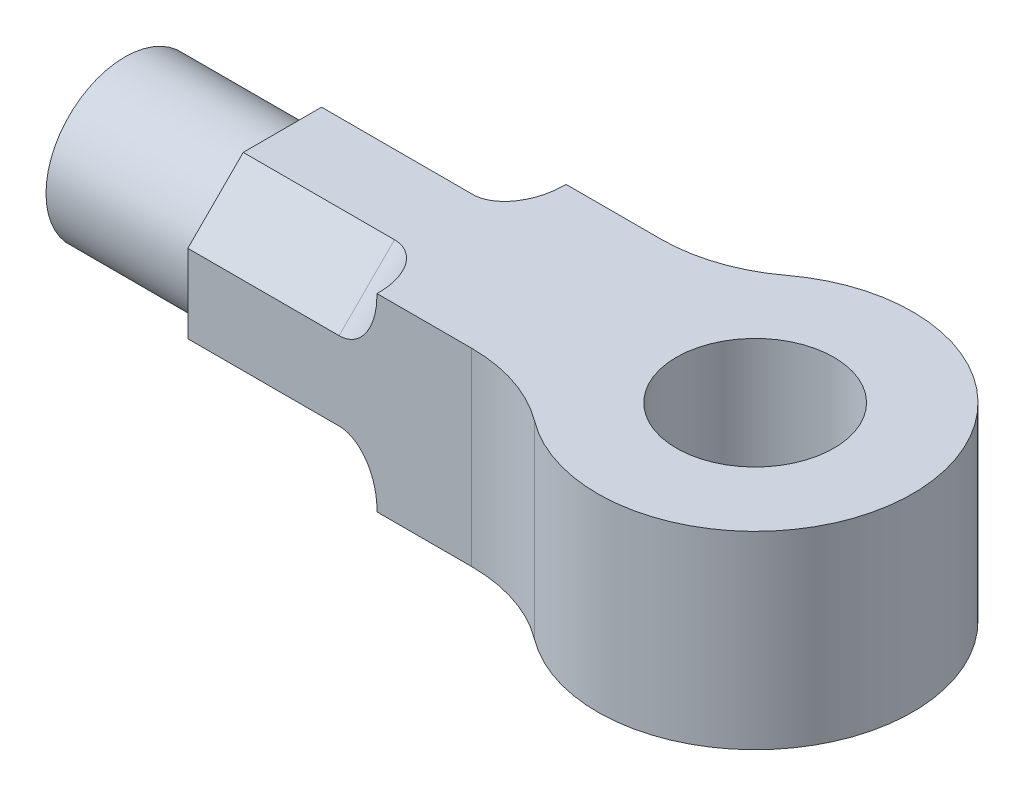
ISO-10303-21;
HEADER;
FILE_DESCRIPTION(('STEP AP214'),'2;1');
FILE_NAME('part.step','',(''),(''),'','','');
FILE_SCHEMA(('AUTOMOTIVE_DESIGN { 1 0 10303 214 1 1 1 1 }'));
ENDSEC;
DATA;
#1=APPLICATION_CONTEXT('core data for automotive mechanical design processes');
#2=APPLICATION_PROTOCOL_DEFINITION('international standard','automotive_design',2000,#1);
#3=PRODUCT_CONTEXT('',#1,'mechanical');
#4=PRODUCT('Part','Part','',(#3));
#5=PRODUCT_RELATED_PRODUCT_CATEGORY('part','',(#4));
#6=PRODUCT_DEFINITION_FORMATION('','',#4);
#7=PRODUCT_DEFINITION_CONTEXT('part definition',#1,'design');
#8=PRODUCT_DEFINITION('design','',#6,#7);
#9=PRODUCT_DEFINITION_SHAPE('','',#8);
#10=(LENGTH_UNIT() NAMED_UNIT(*) SI_UNIT(.MILLI.,.METRE.));
#11=(NAMED_UNIT(*) PLANE_ANGLE_UNIT() SI_UNIT($,.RADIAN.));
#12=(NAMED_UNIT(*) SI_UNIT($,.STERADIAN.) SOLID_ANGLE_UNIT());
#13=UNCERTAINTY_MEASURE_WITH_UNIT(LENGTH_MEASURE(1.E-05),#10,'distance_accuracy_value','');
#14=(GEOMETRIC_REPRESENTATION_CONTEXT(3) GLOBAL_UNCERTAINTY_ASSIGNED_CONTEXT((#13)) GLOBAL_UNIT_ASSIGNED_CONTEXT((#10,
#11,#12)) REPRESENTATION_CONTEXT('',''));
#15=CARTESIAN_POINT('',(0.,0.,0.));
#16=DIRECTION('',(0.,0.,1.));
#17=DIRECTION('',(1.,0.,0.));
#18=AXIS2_PLACEMENT_3D('',#15,#16,#17);
#19=CARTESIAN_POINT('',(0.,60.,60.));
#20=DIRECTION('',(0.,-1.,0.));
#21=DIRECTION('',(1.,0.,0.));
#22=AXIS2_PLACEMENT_3D('',#19,#20,#21);
#23=PLANE('',#22);
#24=CARTESIAN_POINT('',(-50.,60.,30.));
#25=DIRECTION('',(0.,1.,0.));
#26=DIRECTION('',(-1.,0.,0.));
#27=AXIS2_PLACEMENT_3D('',#24,#25,#26);
#28=CIRCLE('',#27,25.);
#29=CARTESIAN_POINT('',(-75.,60.,30.));
#30=VERTEX_POINT('',#29);
#31=EDGE_CURVE('E293',#30,#30,#28,.T.);
#32=ORIENTED_EDGE('',*,*,#31,.F.);
#33=EDGE_LOOP('',(#32));
#34=FACE_BOUND('',#33,.T.);
#35=DIRECTION('',(0.,0.,-1.));
#36=VECTOR('',#35,1.);
#37=CARTESIAN_POINT('',(-140.,60.,0.));
#38=LINE('',#37,#36);
#39=CARTESIAN_POINT('',(-140.,60.,0.603030380330022));
#40=VERTEX_POINT('',#39);
#41=CARTESIAN_POINT('',(-140.,60.,0.));
#42=VERTEX_POINT('',#41);
#43=EDGE_CURVE('E192',#40,#42,#38,.T.);
#44=ORIENTED_EDGE('',*,*,#43,.F.);
#45=CARTESIAN_POINT('',(-152.,60.,0.603030380330022));
#46=DIRECTION('',(0.,-1.,0.));
#47=DIRECTION('',(0.,0.,1.));
#48=AXIS2_PLACEMENT_3D('',#45,#46,#47);
#49=ELLIPSE('',#48,16.9705627484771,12.);
#50=CARTESIAN_POINT('',(-152.,60.,17.5735931288072));
#51=VERTEX_POINT('',#50);
#52=EDGE_CURVE('E178',#40,#51,#49,.T.);
#53=ORIENTED_EDGE('',*,*,#52,.T.);
#54=DIRECTION('',(-1.,0.,0.));
#55=VECTOR('',#54,1.);
#56=CARTESIAN_POINT('',(-140.,60.,17.5735931288072));
#57=LINE('',#56,#55);
#58=CARTESIAN_POINT('',(-200.,60.,17.5735931288072));
#59=VERTEX_POINT('',#58);
#60=EDGE_CURVE('E171',#51,#59,#57,.T.);
#61=ORIENTED_EDGE('',*,*,#60,.T.);
#62=DIRECTION('',(0.,0.,-1.));
#63=VECTOR('',#62,1.);
#64=CARTESIAN_POINT('',(-200.,60.,60.));
#65=LINE('',#64,#63);
#66=CARTESIAN_POINT('',(-200.,60.,42.4264068711929));
#67=VERTEX_POINT('',#66);
#68=EDGE_CURVE('E176',#67,#59,#65,.T.);
#69=ORIENTED_EDGE('',*,*,#68,.F.);
#70=DIRECTION('',(-1.,0.,0.));
#71=VECTOR('',#70,1.);
#72=CARTESIAN_POINT('',(-140.,60.,42.4264068711929));
#73=LINE('',#72,#71);
#74=CARTESIAN_POINT('',(-152.,60.,42.4264068711929));
#75=VERTEX_POINT('',#74);
#76=EDGE_CURVE('E301',#75,#67,#73,.T.);
#77=ORIENTED_EDGE('',*,*,#76,.F.);
#78=CARTESIAN_POINT('',(-152.,60.,59.39696961967));
#79=DIRECTION('',(0.,-1.,0.));
#80=DIRECTION('',(0.,0.,1.));
#81=AXIS2_PLACEMENT_3D('',#78,#79,#80);
#82=ELLIPSE('',#81,16.9705627484771,12.);
#83=CARTESIAN_POINT('',(-140.,60.,59.39696961967));
#84=VERTEX_POINT('',#83);
#85=EDGE_CURVE('E240',#75,#84,#82,.T.);
#86=ORIENTED_EDGE('',*,*,#85,.T.);
#87=DIRECTION('',(0.,0.,-1.));
#88=VECTOR('',#87,1.);
#89=CARTESIAN_POINT('',(-140.,60.,0.));
#90=LINE('',#89,#88);
#91=CARTESIAN_POINT('',(-140.,60.,60.));
#92=VERTEX_POINT('',#91);
#93=EDGE_CURVE('E304',#92,#84,#90,.T.);
#94=ORIENTED_EDGE('',*,*,#93,.F.);
#95=DIRECTION('',(-1.,0.,0.));
#96=VECTOR('',#95,1.);
#97=CARTESIAN_POINT('',(0.,60.,60.));
#98=LINE('',#97,#96);
#99=CARTESIAN_POINT('',(-110.,60.,60.));
#100=VERTEX_POINT('',#99);
#101=EDGE_CURVE('E261',#100,#92,#98,.T.);
#102=ORIENTED_EDGE('',*,*,#101,.F.);
#103=CARTESIAN_POINT('',(-110.,60.,110.));
#104=DIRECTION('',(0.,-1.,0.));
#105=DIRECTION('',(1.,0.,0.));
#106=AXIS2_PLACEMENT_3D('',#103,#104,#105);
#107=CIRCLE('',#106,50.);
#108=CARTESIAN_POINT('',(-80.,60.,70.));
#109=VERTEX_POINT('',#108);
#110=EDGE_CURVE('E54',#100,#109,#107,.T.);
#111=ORIENTED_EDGE('',*,*,#110,.T.);
#112=CARTESIAN_POINT('',(-50.,60.,30.));
#113=DIRECTION('',(0.,1.,0.));
#114=DIRECTION('',(-1.,0.,0.));
#115=AXIS2_PLACEMENT_3D('',#112,#113,#114);
#116=CIRCLE('',#115,50.);
#117=CARTESIAN_POINT('',(-80.,60.,-10.));
#118=VERTEX_POINT('',#117);
#119=EDGE_CURVE('E259',#109,#118,#116,.T.);
#120=ORIENTED_EDGE('',*,*,#119,.T.);
#121=CARTESIAN_POINT('',(-110.,60.,-50.));
#122=DIRECTION('',(0.,-1.,0.));
#123=DIRECTION('',(1.,0.,0.));
#124=AXIS2_PLACEMENT_3D('',#121,#122,#123);
#125=CIRCLE('',#124,50.);
#126=CARTESIAN_POINT('',(-110.,60.,0.));
#127=VERTEX_POINT('',#126);
#128=EDGE_CURVE('E253',#118,#127,#125,.T.);
#129=ORIENTED_EDGE('',*,*,#128,.T.);
#130=DIRECTION('',(-1.,0.,0.));
#131=VECTOR('',#130,1.);
#132=CARTESIAN_POINT('',(0.,60.,0.));
#133=LINE('',#132,#131);
#134=EDGE_CURVE('E283',#127,#42,#133,.T.);
#135=ORIENTED_EDGE('',*,*,#134,.T.);
#136=EDGE_LOOP('',(#44,#53,#61,#69,#77,#86,#94,#102,#111,#120,#129,#135));
#137=FACE_BOUND('',#136,.T.);
#138=ADVANCED_FACE('F46',(#34,#137),#23,.F.);
#139=CARTESIAN_POINT('',(0.,0.,60.));
#140=DIRECTION('',(0.,0.,-1.));
#141=DIRECTION('',(-1.,0.,0.));
#142=AXIS2_PLACEMENT_3D('',#139,#140,#141);
#143=PLANE('',#142);
#144=DIRECTION('',(1.,0.,0.));
#145=VECTOR('',#144,1.);
#146=CARTESIAN_POINT('',(0.,0.,60.));
#147=LINE('',#146,#145);
#148=CARTESIAN_POINT('',(-140.,0.,60.));
#149=VERTEX_POINT('',#148);
#150=CARTESIAN_POINT('',(-110.,0.,60.));
#151=VERTEX_POINT('',#150);
#152=EDGE_CURVE('E207',#149,#151,#147,.T.);
#153=ORIENTED_EDGE('',*,*,#152,.T.);
#154=DIRECTION('',(0.,1.,0.));
#155=VECTOR('',#154,1.);
#156=CARTESIAN_POINT('',(-110.,0.,60.));
#157=LINE('',#156,#155);
#158=EDGE_CURVE('E251',#151,#100,#157,.T.);
#159=ORIENTED_EDGE('',*,*,#158,.T.);
#160=ORIENTED_EDGE('',*,*,#101,.T.);
#161=DIRECTION('',(0.,1.,0.));
#162=VECTOR('',#161,1.);
#163=CARTESIAN_POINT('',(-140.,0.,60.));
#164=LINE('',#163,#162);
#165=CARTESIAN_POINT('',(-140.,59.39696961967,60.));
#166=VERTEX_POINT('',#165);
#167=EDGE_CURVE('E307',#166,#92,#164,.T.);
#168=ORIENTED_EDGE('',*,*,#167,.F.);
#169=CARTESIAN_POINT('',(-152.,59.39696961967,60.));
#170=DIRECTION('',(0.,0.,-1.));
#171=DIRECTION('',(0.,-1.,0.));
#172=AXIS2_PLACEMENT_3D('',#169,#170,#171);
#173=ELLIPSE('',#172,16.9705627484771,12.);
#174=CARTESIAN_POINT('',(-152.,42.4264068711928,60.));
#175=VERTEX_POINT('',#174);
#176=EDGE_CURVE('E242',#166,#175,#173,.T.);
#177=ORIENTED_EDGE('',*,*,#176,.T.);
#178=DIRECTION('',(-1.,0.,0.));
#179=VECTOR('',#178,1.);
#180=CARTESIAN_POINT('',(-140.,42.4264068711928,60.));
#181=LINE('',#180,#179);
#182=CARTESIAN_POINT('',(-200.,42.4264068711928,60.));
#183=VERTEX_POINT('',#182);
#184=EDGE_CURVE('E302',#175,#183,#181,.T.);
#185=ORIENTED_EDGE('',*,*,#184,.T.);
#186=DIRECTION('',(0.,-1.,0.));
#187=VECTOR('',#186,1.);
#188=CARTESIAN_POINT('',(-200.,60.,60.));
#189=LINE('',#188,#187);
#190=CARTESIAN_POINT('',(-200.,17.5735931288072,60.));
#191=VERTEX_POINT('',#190);
#192=EDGE_CURVE('E277',#183,#191,#189,.T.);
#193=ORIENTED_EDGE('',*,*,#192,.T.);
#194=DIRECTION('',(-1.,0.,0.));
#195=VECTOR('',#194,1.);
#196=CARTESIAN_POINT('',(-140.,17.5735931288072,60.));
#197=LINE('',#196,#195);
#198=CARTESIAN_POINT('',(-152.,17.5735931288072,60.));
#199=VERTEX_POINT('',#198);
#200=EDGE_CURVE('E313',#199,#191,#197,.T.);
#201=ORIENTED_EDGE('',*,*,#200,.F.);
#202=CARTESIAN_POINT('',(-152.,0.603030380330022,60.));
#203=DIRECTION('',(0.,0.,-1.));
#204=DIRECTION('',(0.,-1.,0.));
#205=AXIS2_PLACEMENT_3D('',#202,#203,#204);
#206=ELLIPSE('',#205,16.9705627484771,12.);
#207=CARTESIAN_POINT('',(-140.,0.603030380330022,60.));
#208=VERTEX_POINT('',#207);
#209=EDGE_CURVE('E233',#199,#208,#206,.T.);
#210=ORIENTED_EDGE('',*,*,#209,.T.);
#211=DIRECTION('',(0.,1.,0.));
#212=VECTOR('',#211,1.);
#213=CARTESIAN_POINT('',(-140.,0.,60.));
#214=LINE('',#213,#212);
#215=EDGE_CURVE('E275',#149,#208,#214,.T.);
#216=ORIENTED_EDGE('',*,*,#215,.F.);
#217=EDGE_LOOP('',(#153,#159,#160,#168,#177,#185,#193,#201,#210,#216));
#218=FACE_BOUND('',#217,.T.);
#219=ADVANCED_FACE('F270',(#218),#143,.F.);
#220=CARTESIAN_POINT('',(-200.,60.,60.));
#221=DIRECTION('',(1.,0.,0.));
#222=DIRECTION('',(0.,0.,-1.));
#223=AXIS2_PLACEMENT_3D('',#220,#221,#222);
#224=PLANE('',#223);
#225=CARTESIAN_POINT('',(-200.,30.,30.));
#226=DIRECTION('',(1.,0.,0.));
#227=DIRECTION('',(0.,0.,-1.));
#228=AXIS2_PLACEMENT_3D('',#225,#226,#227);
#229=CIRCLE('',#228,25.);
#230=CARTESIAN_POINT('',(-200.,30.,4.99999999999999));
#231=VERTEX_POINT('',#230);
#232=EDGE_CURVE('E200',#231,#231,#229,.F.);
#233=ORIENTED_EDGE('',*,*,#232,.F.);
#234=EDGE_LOOP('',(#233));
#235=FACE_BOUND('',#234,.T.);
#236=DIRECTION('',(0.,-0.707106781186548,-0.707106781186547));
#237=VECTOR('',#236,1.);
#238=CARTESIAN_POINT('',(-200.,21.2132034355964,-21.2132034355964));
#239=LINE('',#238,#237);
#240=CARTESIAN_POINT('',(-200.,42.4264068711928,0.));
#241=VERTEX_POINT('',#240);
#242=EDGE_CURVE('E186',#59,#241,#239,.T.);
#243=ORIENTED_EDGE('',*,*,#242,.T.);
#244=DIRECTION('',(0.,-1.,0.));
#245=VECTOR('',#244,1.);
#246=CARTESIAN_POINT('',(-200.,60.,0.));
#247=LINE('',#246,#245);
#248=CARTESIAN_POINT('',(-200.,17.5735931288071,0.));
#249=VERTEX_POINT('',#248);
#250=EDGE_CURVE('E285',#241,#249,#247,.T.);
#251=ORIENTED_EDGE('',*,*,#250,.T.);
#252=DIRECTION('',(0.,-0.707106781186547,0.707106781186548));
#253=VECTOR('',#252,1.);
#254=CARTESIAN_POINT('',(-200.,8.78679656440359,8.78679656440359));
#255=LINE('',#254,#253);
#256=CARTESIAN_POINT('',(-200.,0.,17.5735931288072));
#257=VERTEX_POINT('',#256);
#258=EDGE_CURVE('E315',#249,#257,#255,.T.);
#259=ORIENTED_EDGE('',*,*,#258,.T.);
#260=DIRECTION('',(0.,0.,-1.));
#261=VECTOR('',#260,1.);
#262=CARTESIAN_POINT('',(-200.,0.,60.));
#263=LINE('',#262,#261);
#264=CARTESIAN_POINT('',(-200.,0.,42.4264068711928));
#265=VERTEX_POINT('',#264);
#266=EDGE_CURVE('E201',#265,#257,#263,.T.);
#267=ORIENTED_EDGE('',*,*,#266,.F.);
#268=DIRECTION('',(0.,0.707106781186548,0.707106781186547));
#269=VECTOR('',#268,1.);
#270=CARTESIAN_POINT('',(-200.,-21.2132034355964,21.2132034355964));
#271=LINE('',#270,#269);
#272=EDGE_CURVE('E316',#265,#191,#271,.T.);
#273=ORIENTED_EDGE('',*,*,#272,.T.);
#274=ORIENTED_EDGE('',*,*,#192,.F.);
#275=DIRECTION('',(0.,0.707106781186548,-0.707106781186547));
#276=VECTOR('',#275,1.);
#277=CARTESIAN_POINT('',(-200.,51.2132034355964,51.2132034355964));
#278=LINE('',#277,#276);
#279=EDGE_CURVE('E199',#183,#67,#278,.T.);
#280=ORIENTED_EDGE('',*,*,#279,.T.);
#281=ORIENTED_EDGE('',*,*,#68,.T.);
#282=EDGE_LOOP('',(#243,#251,#259,#267,#273,#274,#280,#281));
#283=FACE_BOUND('',#282,.T.);
#284=ADVANCED_FACE('F196',(#235,#283),#224,.F.);
#285=CARTESIAN_POINT('',(0.,0.,60.));
#286=DIRECTION('',(0.,1.,0.));
#287=DIRECTION('',(-1.,0.,0.));
#288=AXIS2_PLACEMENT_3D('',#285,#286,#287);
#289=PLANE('',#288);
#290=CARTESIAN_POINT('',(-50.,0.,30.));
#291=DIRECTION('',(0.,1.,0.));
#292=DIRECTION('',(-1.,0.,0.));
#293=AXIS2_PLACEMENT_3D('',#290,#291,#292);
#294=CIRCLE('',#293,25.);
#295=CARTESIAN_POINT('',(-75.,0.,30.));
#296=VERTEX_POINT('',#295);
#297=EDGE_CURVE('E267',#296,#296,#294,.T.);
#298=ORIENTED_EDGE('',*,*,#297,.T.);
#299=EDGE_LOOP('',(#298));
#300=FACE_BOUND('',#299,.T.);
#301=DIRECTION('',(-1.,0.,0.));
#302=VECTOR('',#301,1.);
#303=CARTESIAN_POINT('',(-140.,0.,17.5735931288072));
#304=LINE('',#303,#302);
#305=CARTESIAN_POINT('',(-152.,0.,17.5735931288072));
#306=VERTEX_POINT('',#305);
#307=EDGE_CURVE('E193',#306,#257,#304,.T.);
#308=ORIENTED_EDGE('',*,*,#307,.F.);
#309=CARTESIAN_POINT('',(-152.,0.,0.60303038033005));
#310=DIRECTION('',(0.,1.,0.));
#311=DIRECTION('',(0.,0.,-1.));
#312=AXIS2_PLACEMENT_3D('',#309,#310,#311);
#313=ELLIPSE('',#312,16.9705627484771,12.);
#314=CARTESIAN_POINT('',(-140.,0.,0.60303038033005));
#315=VERTEX_POINT('',#314);
#316=EDGE_CURVE('E229',#306,#315,#313,.T.);
#317=ORIENTED_EDGE('',*,*,#316,.T.);
#318=DIRECTION('',(0.,0.,1.));
#319=VECTOR('',#318,1.);
#320=CARTESIAN_POINT('',(-140.,0.,0.));
#321=LINE('',#320,#319);
#322=CARTESIAN_POINT('',(-140.,0.,0.));
#323=VERTEX_POINT('',#322);
#324=EDGE_CURVE('E324',#323,#315,#321,.T.);
#325=ORIENTED_EDGE('',*,*,#324,.F.);
#326=DIRECTION('',(1.,0.,0.));
#327=VECTOR('',#326,1.);
#328=CARTESIAN_POINT('',(0.,0.,0.));
#329=LINE('',#328,#327);
#330=CARTESIAN_POINT('',(-110.,0.,0.));
#331=VERTEX_POINT('',#330);
#332=EDGE_CURVE('E286',#323,#331,#329,.T.);
#333=ORIENTED_EDGE('',*,*,#332,.T.);
#334=CARTESIAN_POINT('',(-110.,0.,-50.));
#335=DIRECTION('',(0.,1.,0.));
#336=DIRECTION('',(-1.,0.,0.));
#337=AXIS2_PLACEMENT_3D('',#334,#335,#336);
#338=CIRCLE('',#337,50.);
#339=CARTESIAN_POINT('',(-80.,0.,-10.));
#340=VERTEX_POINT('',#339);
#341=EDGE_CURVE('E255',#331,#340,#338,.T.);
#342=ORIENTED_EDGE('',*,*,#341,.T.);
#343=CARTESIAN_POINT('',(-50.,0.,30.));
#344=DIRECTION('',(0.,1.,0.));
#345=DIRECTION('',(-1.,0.,0.));
#346=AXIS2_PLACEMENT_3D('',#343,#344,#345);
#347=CIRCLE('',#346,50.);
#348=CARTESIAN_POINT('',(-80.,0.,70.));
#349=VERTEX_POINT('',#348);
#350=EDGE_CURVE('E266',#349,#340,#347,.T.);
#351=ORIENTED_EDGE('',*,*,#350,.F.);
#352=CARTESIAN_POINT('',(-110.,0.,110.));
#353=DIRECTION('',(0.,1.,0.));
#354=DIRECTION('',(-1.,0.,0.));
#355=AXIS2_PLACEMENT_3D('',#352,#353,#354);
#356=CIRCLE('',#355,50.);
#357=EDGE_CURVE('E13',#349,#151,#356,.T.);
#358=ORIENTED_EDGE('',*,*,#357,.T.);
#359=ORIENTED_EDGE('',*,*,#152,.F.);
#360=DIRECTION('',(0.,0.,1.));
#361=VECTOR('',#360,1.);
#362=CARTESIAN_POINT('',(-140.,0.,0.));
#363=LINE('',#362,#361);
#364=CARTESIAN_POINT('',(-140.,0.,59.3969696196699));
#365=VERTEX_POINT('',#364);
#366=EDGE_CURVE('E319',#365,#149,#363,.T.);
#367=ORIENTED_EDGE('',*,*,#366,.F.);
#368=CARTESIAN_POINT('',(-152.,0.,59.39696961967));
#369=DIRECTION('',(0.,1.,0.));
#370=DIRECTION('',(0.,0.,-1.));
#371=AXIS2_PLACEMENT_3D('',#368,#369,#370);
#372=ELLIPSE('',#371,16.9705627484771,12.);
#373=CARTESIAN_POINT('',(-152.,0.,42.4264068711928));
#374=VERTEX_POINT('',#373);
#375=EDGE_CURVE('E235',#365,#374,#372,.T.);
#376=ORIENTED_EDGE('',*,*,#375,.T.);
#377=DIRECTION('',(-1.,0.,0.));
#378=VECTOR('',#377,1.);
#379=CARTESIAN_POINT('',(-140.,0.,42.4264068711928));
#380=LINE('',#379,#378);
#381=EDGE_CURVE('E311',#374,#265,#380,.T.);
#382=ORIENTED_EDGE('',*,*,#381,.T.);
#383=ORIENTED_EDGE('',*,*,#266,.T.);
#384=EDGE_LOOP('',(#308,#317,#325,#333,#342,#351,#358,#359,#367,#376,#382,#383));
#385=FACE_BOUND('',#384,.T.);
#386=ADVANCED_FACE('F390',(#300,#385),#289,.F.);
#387=CARTESIAN_POINT('',(0.,0.,0.));
#388=DIRECTION('',(0.,0.,-1.));
#389=DIRECTION('',(-1.,0.,0.));
#390=AXIS2_PLACEMENT_3D('',#387,#388,#389);
#391=PLANE('',#390);
#392=ORIENTED_EDGE('',*,*,#134,.F.);
#393=DIRECTION('',(0.,-1.,0.));
#394=VECTOR('',#393,1.);
#395=CARTESIAN_POINT('',(-110.,0.,0.));
#396=LINE('',#395,#394);
#397=EDGE_CURVE('E249',#127,#331,#396,.T.);
#398=ORIENTED_EDGE('',*,*,#397,.T.);
#399=ORIENTED_EDGE('',*,*,#332,.F.);
#400=DIRECTION('',(0.,-1.,0.));
#401=VECTOR('',#400,1.);
#402=CARTESIAN_POINT('',(-140.,0.,0.));
#403=LINE('',#402,#401);
#404=CARTESIAN_POINT('',(-140.,0.603030380330022,0.));
#405=VERTEX_POINT('',#404);
#406=EDGE_CURVE('E328',#405,#323,#403,.T.);
#407=ORIENTED_EDGE('',*,*,#406,.F.);
#408=CARTESIAN_POINT('',(-152.,0.603030380330022,0.));
#409=DIRECTION('',(0.,0.,-1.));
#410=DIRECTION('',(0.,1.,0.));
#411=AXIS2_PLACEMENT_3D('',#408,#409,#410);
#412=ELLIPSE('',#411,16.9705627484771,12.);
#413=CARTESIAN_POINT('',(-152.,17.5735931288071,0.));
#414=VERTEX_POINT('',#413);
#415=EDGE_CURVE('E231',#405,#414,#412,.F.);
#416=ORIENTED_EDGE('',*,*,#415,.T.);
#417=DIRECTION('',(-1.,0.,0.));
#418=VECTOR('',#417,1.);
#419=CARTESIAN_POINT('',(-140.,17.5735931288071,0.));
#420=LINE('',#419,#418);
#421=EDGE_CURVE('E322',#414,#249,#420,.T.);
#422=ORIENTED_EDGE('',*,*,#421,.T.);
#423=ORIENTED_EDGE('',*,*,#250,.F.);
#424=DIRECTION('',(-1.,0.,0.));
#425=VECTOR('',#424,1.);
#426=CARTESIAN_POINT('',(-140.,42.4264068711928,0.));
#427=LINE('',#426,#425);
#428=CARTESIAN_POINT('',(-152.,42.4264068711928,0.));
#429=VERTEX_POINT('',#428);
#430=EDGE_CURVE('E182',#429,#241,#427,.T.);
#431=ORIENTED_EDGE('',*,*,#430,.F.);
#432=CARTESIAN_POINT('',(-152.,59.3969696196699,0.));
#433=DIRECTION('',(0.,0.,-1.));
#434=DIRECTION('',(0.,1.,0.));
#435=AXIS2_PLACEMENT_3D('',#432,#433,#434);
#436=ELLIPSE('',#435,16.9705627484771,12.);
#437=CARTESIAN_POINT('',(-140.,59.3969696196699,0.));
#438=VERTEX_POINT('',#437);
#439=EDGE_CURVE('E237',#429,#438,#436,.F.);
#440=ORIENTED_EDGE('',*,*,#439,.T.);
#441=DIRECTION('',(0.,-1.,0.));
#442=VECTOR('',#441,1.);
#443=CARTESIAN_POINT('',(-140.,0.,0.));
#444=LINE('',#443,#442);
#445=EDGE_CURVE('E183',#42,#438,#444,.T.);
#446=ORIENTED_EDGE('',*,*,#445,.F.);
#447=EDGE_LOOP('',(#392,#398,#399,#407,#416,#422,#423,#431,#440,#446));
#448=FACE_BOUND('',#447,.T.);
#449=ADVANCED_FACE('F342',(#448),#391,.T.);
#450=CARTESIAN_POINT('',(-50.,0.,30.));
#451=DIRECTION('',(0.,1.,0.));
#452=DIRECTION('',(-1.,0.,0.));
#453=AXIS2_PLACEMENT_3D('',#450,#451,#452);
#454=CYLINDRICAL_SURFACE('',#453,50.);
#455=ORIENTED_EDGE('',*,*,#350,.T.);
#456=DIRECTION('',(0.,1.,0.));
#457=VECTOR('',#456,1.);
#458=CARTESIAN_POINT('',(-80.,0.,-10.));
#459=LINE('',#458,#457);
#460=EDGE_CURVE('E246',#340,#118,#459,.T.);
#461=ORIENTED_EDGE('',*,*,#460,.T.);
#462=ORIENTED_EDGE('',*,*,#119,.F.);
#463=DIRECTION('',(0.,1.,0.));
#464=VECTOR('',#463,1.);
#465=CARTESIAN_POINT('',(-80.,0.,70.));
#466=LINE('',#465,#464);
#467=EDGE_CURVE('E244',#109,#349,#466,.F.);
#468=ORIENTED_EDGE('',*,*,#467,.T.);
#469=EDGE_LOOP('',(#455,#461,#462,#468));
#470=FACE_BOUND('',#469,.T.);
#471=ADVANCED_FACE('F264',(#470),#454,.T.);
#472=CARTESIAN_POINT('',(-50.,0.,30.));
#473=DIRECTION('',(0.,1.,0.));
#474=DIRECTION('',(-1.,0.,0.));
#475=AXIS2_PLACEMENT_3D('',#472,#473,#474);
#476=CYLINDRICAL_SURFACE('',#475,25.);
#477=ORIENTED_EDGE('',*,*,#297,.F.);
#478=EDGE_LOOP('',(#477));
#479=FACE_BOUND('',#478,.T.);
#480=ORIENTED_EDGE('',*,*,#31,.T.);
#481=EDGE_LOOP('',(#480));
#482=FACE_BOUND('',#481,.T.);
#483=ADVANCED_FACE('F423',(#479,#482),#476,.F.);
#484=CARTESIAN_POINT('',(-250.,30.,30.));
#485=DIRECTION('',(1.,0.,0.));
#486=DIRECTION('',(0.,0.,-1.));
#487=AXIS2_PLACEMENT_3D('',#484,#485,#486);
#488=CYLINDRICAL_SURFACE('',#487,25.);
#489=CARTESIAN_POINT('',(-250.,30.,30.));
#490=DIRECTION('',(-1.,0.,0.));
#491=DIRECTION('',(0.,0.,1.));
#492=AXIS2_PLACEMENT_3D('',#489,#490,#491);
#493=CIRCLE('',#492,25.);
#494=CARTESIAN_POINT('',(-250.,30.,55.));
#495=VERTEX_POINT('',#494);
#496=EDGE_CURVE('E296',#495,#495,#493,.T.);
#497=ORIENTED_EDGE('',*,*,#496,.F.);
#498=EDGE_LOOP('',(#497));
#499=FACE_BOUND('',#498,.T.);
#500=ORIENTED_EDGE('',*,*,#232,.T.);
#501=EDGE_LOOP('',(#500));
#502=FACE_BOUND('',#501,.T.);
#503=ADVANCED_FACE('F419',(#499,#502),#488,.T.);
#504=CARTESIAN_POINT('',(-250.,30.,30.));
#505=DIRECTION('',(-1.,0.,0.));
#506=DIRECTION('',(0.,0.,1.));
#507=AXIS2_PLACEMENT_3D('',#504,#505,#506);
#508=PLANE('',#507);
#509=ORIENTED_EDGE('',*,*,#496,.T.);
#510=EDGE_LOOP('',(#509));
#511=FACE_BOUND('',#510,.T.);
#512=ADVANCED_FACE('F413',(#511),#508,.T.);
#513=CARTESIAN_POINT('',(-140.,51.2132034355964,51.2132034355964));
#514=DIRECTION('',(0.,0.707106781186547,0.707106781186548));
#515=DIRECTION('',(0.,-0.707106781186548,0.707106781186547));
#516=AXIS2_PLACEMENT_3D('',#513,#514,#515);
#517=PLANE('',#516);
#518=ORIENTED_EDGE('',*,*,#184,.F.);
#519=DIRECTION('',(0.,0.707106781186548,-0.707106781186547));
#520=VECTOR('',#519,1.);
#521=CARTESIAN_POINT('',(-152.,60.,42.4264068711929));
#522=LINE('',#521,#520);
#523=EDGE_CURVE('E224',#175,#75,#522,.T.);
#524=ORIENTED_EDGE('',*,*,#523,.T.);
#525=ORIENTED_EDGE('',*,*,#76,.T.);
#526=ORIENTED_EDGE('',*,*,#279,.F.);
#527=EDGE_LOOP('',(#518,#524,#525,#526));
#528=FACE_BOUND('',#527,.T.);
#529=ADVANCED_FACE('F401',(#528),#517,.T.);
#530=CARTESIAN_POINT('',(-140.,0.,0.));
#531=DIRECTION('',(-1.,0.,0.));
#532=DIRECTION('',(0.,0.,1.));
#533=AXIS2_PLACEMENT_3D('',#530,#531,#532);
#534=PLANE('',#533);
#535=ORIENTED_EDGE('',*,*,#93,.T.);
#536=DIRECTION('',(0.,0.707106781186548,-0.707106781186547));
#537=VECTOR('',#536,1.);
#538=CARTESIAN_POINT('',(-140.,50.9116882454314,68.4852813742386));
#539=LINE('',#538,#537);
#540=EDGE_CURVE('E227',#84,#166,#539,.F.);
#541=ORIENTED_EDGE('',*,*,#540,.T.);
#542=ORIENTED_EDGE('',*,*,#167,.T.);
#543=EDGE_LOOP('',(#535,#541,#542));
#544=FACE_BOUND('',#543,.T.);
#545=ADVANCED_FACE('F404',(#544),#534,.T.);
#546=CARTESIAN_POINT('',(-140.,8.78679656440359,8.78679656440359));
#547=DIRECTION('',(0.,-0.707106781186548,-0.707106781186547));
#548=DIRECTION('',(0.,0.707106781186547,-0.707106781186548));
#549=AXIS2_PLACEMENT_3D('',#546,#547,#548);
#550=PLANE('',#549);
#551=ORIENTED_EDGE('',*,*,#421,.F.);
#552=DIRECTION('',(0.,-0.707106781186547,0.707106781186548));
#553=VECTOR('',#552,1.);
#554=CARTESIAN_POINT('',(-152.,0.,17.5735931288072));
#555=LINE('',#554,#553);
#556=EDGE_CURVE('E204',#414,#306,#555,.T.);
#557=ORIENTED_EDGE('',*,*,#556,.T.);
#558=ORIENTED_EDGE('',*,*,#307,.T.);
#559=ORIENTED_EDGE('',*,*,#258,.F.);
#560=EDGE_LOOP('',(#551,#557,#558,#559));
#561=FACE_BOUND('',#560,.T.);
#562=ADVANCED_FACE('F387',(#561),#550,.T.);
#563=CARTESIAN_POINT('',(-140.,0.,0.));
#564=DIRECTION('',(-1.,0.,0.));
#565=DIRECTION('',(0.,0.,1.));
#566=AXIS2_PLACEMENT_3D('',#563,#564,#565);
#567=PLANE('',#566);
#568=ORIENTED_EDGE('',*,*,#324,.T.);
#569=DIRECTION('',(0.,-0.707106781186547,0.707106781186548));
#570=VECTOR('',#569,1.);
#571=CARTESIAN_POINT('',(-140.,9.08831175456859,-8.48528137423857));
#572=LINE('',#571,#570);
#573=EDGE_CURVE('E213',#315,#405,#572,.F.);
#574=ORIENTED_EDGE('',*,*,#573,.T.);
#575=ORIENTED_EDGE('',*,*,#406,.T.);
#576=EDGE_LOOP('',(#568,#574,#575));
#577=FACE_BOUND('',#576,.T.);
#578=ADVANCED_FACE('F411',(#577),#567,.T.);
#579=CARTESIAN_POINT('',(-140.,21.2132034355964,-21.2132034355964));
#580=DIRECTION('',(0.,0.707106781186547,-0.707106781186548));
#581=DIRECTION('',(0.,0.707106781186548,0.707106781186547));
#582=AXIS2_PLACEMENT_3D('',#579,#580,#581);
#583=PLANE('',#582);
#584=ORIENTED_EDGE('',*,*,#60,.F.);
#585=DIRECTION('',(0.,-0.707106781186548,-0.707106781186547));
#586=VECTOR('',#585,1.);
#587=CARTESIAN_POINT('',(-152.,42.4264068711928,0.));
#588=LINE('',#587,#586);
#589=EDGE_CURVE('E220',#51,#429,#588,.T.);
#590=ORIENTED_EDGE('',*,*,#589,.T.);
#591=ORIENTED_EDGE('',*,*,#430,.T.);
#592=ORIENTED_EDGE('',*,*,#242,.F.);
#593=EDGE_LOOP('',(#584,#590,#591,#592));
#594=FACE_BOUND('',#593,.T.);
#595=ADVANCED_FACE('F187',(#594),#583,.T.);
#596=CARTESIAN_POINT('',(-140.,0.,0.));
#597=DIRECTION('',(-1.,0.,0.));
#598=DIRECTION('',(0.,0.,1.));
#599=AXIS2_PLACEMENT_3D('',#596,#597,#598);
#600=PLANE('',#599);
#601=ORIENTED_EDGE('',*,*,#445,.T.);
#602=DIRECTION('',(0.,-0.707106781186548,-0.707106781186547));
#603=VECTOR('',#602,1.);
#604=CARTESIAN_POINT('',(-140.,68.4852813742385,9.08831175456859));
#605=LINE('',#604,#603);
#606=EDGE_CURVE('E222',#438,#40,#605,.F.);
#607=ORIENTED_EDGE('',*,*,#606,.T.);
#608=ORIENTED_EDGE('',*,*,#43,.T.);
#609=EDGE_LOOP('',(#601,#607,#608));
#610=FACE_BOUND('',#609,.T.);
#611=ADVANCED_FACE('F338',(#610),#600,.T.);
#612=CARTESIAN_POINT('',(-140.,-21.2132034355964,21.2132034355964));
#613=DIRECTION('',(0.,-0.707106781186547,0.707106781186548));
#614=DIRECTION('',(0.,-0.707106781186548,-0.707106781186547));
#615=AXIS2_PLACEMENT_3D('',#612,#613,#614);
#616=PLANE('',#615);
#617=ORIENTED_EDGE('',*,*,#381,.F.);
#618=DIRECTION('',(0.,0.707106781186548,0.707106781186547));
#619=VECTOR('',#618,1.);
#620=CARTESIAN_POINT('',(-152.,17.5735931288072,60.));
#621=LINE('',#620,#619);
#622=EDGE_CURVE('E215',#374,#199,#621,.T.);
#623=ORIENTED_EDGE('',*,*,#622,.T.);
#624=ORIENTED_EDGE('',*,*,#200,.T.);
#625=ORIENTED_EDGE('',*,*,#272,.F.);
#626=EDGE_LOOP('',(#617,#623,#624,#625));
#627=FACE_BOUND('',#626,.T.);
#628=ADVANCED_FACE('F377',(#627),#616,.T.);
#629=CARTESIAN_POINT('',(-140.,0.,0.));
#630=DIRECTION('',(-1.,0.,0.));
#631=DIRECTION('',(0.,0.,1.));
#632=AXIS2_PLACEMENT_3D('',#629,#630,#631);
#633=PLANE('',#632);
#634=ORIENTED_EDGE('',*,*,#215,.T.);
#635=DIRECTION('',(0.,0.707106781186548,0.707106781186547));
#636=VECTOR('',#635,1.);
#637=CARTESIAN_POINT('',(-140.,-8.48528137423857,50.9116882454314));
#638=LINE('',#637,#636);
#639=EDGE_CURVE('E218',#208,#365,#638,.F.);
#640=ORIENTED_EDGE('',*,*,#639,.T.);
#641=ORIENTED_EDGE('',*,*,#366,.T.);
#642=EDGE_LOOP('',(#634,#640,#641));
#643=FACE_BOUND('',#642,.T.);
#644=ADVANCED_FACE('F372',(#643),#633,.T.);
#645=CARTESIAN_POINT('',(-152.,0.301515190164997,0.301515190164997));
#646=DIRECTION('',(0.,0.707106781186547,-0.707106781186548));
#647=DIRECTION('',(0.,0.707106781186548,0.707106781186547));
#648=AXIS2_PLACEMENT_3D('',#645,#646,#647);
#649=CYLINDRICAL_SURFACE('',#648,12.);
#650=ORIENTED_EDGE('',*,*,#415,.F.);
#651=ORIENTED_EDGE('',*,*,#573,.F.);
#652=ORIENTED_EDGE('',*,*,#316,.F.);
#653=ORIENTED_EDGE('',*,*,#556,.F.);
#654=EDGE_LOOP('',(#650,#651,#652,#653));
#655=FACE_BOUND('',#654,.T.);
#656=ADVANCED_FACE('F357',(#655),#649,.F.);
#657=CARTESIAN_POINT('',(-152.,-29.698484809835,29.698484809835));
#658=DIRECTION('',(0.,-0.707106781186548,-0.707106781186547));
#659=DIRECTION('',(0.,0.707106781186547,-0.707106781186548));
#660=AXIS2_PLACEMENT_3D('',#657,#658,#659);
#661=CYLINDRICAL_SURFACE('',#660,12.);
#662=ORIENTED_EDGE('',*,*,#375,.F.);
#663=ORIENTED_EDGE('',*,*,#639,.F.);
#664=ORIENTED_EDGE('',*,*,#209,.F.);
#665=ORIENTED_EDGE('',*,*,#622,.F.);
#666=EDGE_LOOP('',(#662,#663,#664,#665));
#667=FACE_BOUND('',#666,.T.);
#668=ADVANCED_FACE('F348',(#667),#661,.F.);
#669=CARTESIAN_POINT('',(-152.,29.6984848098349,-29.698484809835));
#670=DIRECTION('',(0.,0.707106781186548,0.707106781186547));
#671=DIRECTION('',(0.,-0.707106781186547,0.707106781186548));
#672=AXIS2_PLACEMENT_3D('',#669,#670,#671);
#673=CYLINDRICAL_SURFACE('',#672,12.);
#674=ORIENTED_EDGE('',*,*,#52,.F.);
#675=ORIENTED_EDGE('',*,*,#606,.F.);
#676=ORIENTED_EDGE('',*,*,#439,.F.);
#677=ORIENTED_EDGE('',*,*,#589,.F.);
#678=EDGE_LOOP('',(#674,#675,#676,#677));
#679=FACE_BOUND('',#678,.T.);
#680=ADVANCED_FACE('F345',(#679),#673,.F.);
#681=CARTESIAN_POINT('',(-152.,59.698484809835,59.698484809835));
#682=DIRECTION('',(0.,-0.707106781186548,0.707106781186547));
#683=DIRECTION('',(0.,-0.707106781186547,-0.707106781186548));
#684=AXIS2_PLACEMENT_3D('',#681,#682,#683);
#685=CYLINDRICAL_SURFACE('',#684,12.);
#686=ORIENTED_EDGE('',*,*,#176,.F.);
#687=ORIENTED_EDGE('',*,*,#540,.F.);
#688=ORIENTED_EDGE('',*,*,#85,.F.);
#689=ORIENTED_EDGE('',*,*,#523,.F.);
#690=EDGE_LOOP('',(#686,#687,#688,#689));
#691=FACE_BOUND('',#690,.T.);
#692=ADVANCED_FACE('F347',(#691),#685,.F.);
#693=CARTESIAN_POINT('',(-110.,0.,-50.));
#694=DIRECTION('',(0.,1.,0.));
#695=DIRECTION('',(-1.,0.,0.));
#696=AXIS2_PLACEMENT_3D('',#693,#694,#695);
#697=CYLINDRICAL_SURFACE('',#696,50.);
#698=ORIENTED_EDGE('',*,*,#341,.F.);
#699=ORIENTED_EDGE('',*,*,#397,.F.);
#700=ORIENTED_EDGE('',*,*,#128,.F.);
#701=ORIENTED_EDGE('',*,*,#460,.F.);
#702=EDGE_LOOP('',(#698,#699,#700,#701));
#703=FACE_BOUND('',#702,.T.);
#704=ADVANCED_FACE('F354',(#703),#697,.F.);
#705=CARTESIAN_POINT('',(-110.,0.,110.));
#706=DIRECTION('',(0.,1.,0.));
#707=DIRECTION('',(-1.,0.,0.));
#708=AXIS2_PLACEMENT_3D('',#705,#706,#707);
#709=CYLINDRICAL_SURFACE('',#708,50.);
#710=ORIENTED_EDGE('',*,*,#357,.F.);
#711=ORIENTED_EDGE('',*,*,#467,.F.);
#712=ORIENTED_EDGE('',*,*,#110,.F.);
#713=ORIENTED_EDGE('',*,*,#158,.F.);
#714=EDGE_LOOP('',(#710,#711,#712,#713));
#715=FACE_BOUND('',#714,.T.);
#716=ADVANCED_FACE('F48',(#715),#709,.F.);
#717=CLOSED_SHELL('',(#138,#219,#284,#386,#449,#471,#483,#503,#512,#529,#545,#562,#578,#595,
#611,#628,#644,#656,#668,#680,#692,#704,#716));
#718=MANIFOLD_SOLID_BREP('B2',#717);
#719=ADVANCED_BREP_SHAPE_REPRESENTATION('',(#18,#718),#14);
#720=SHAPE_DEFINITION_REPRESENTATION(#9,#719);
ENDSEC;
END-ISO-10303-21;
